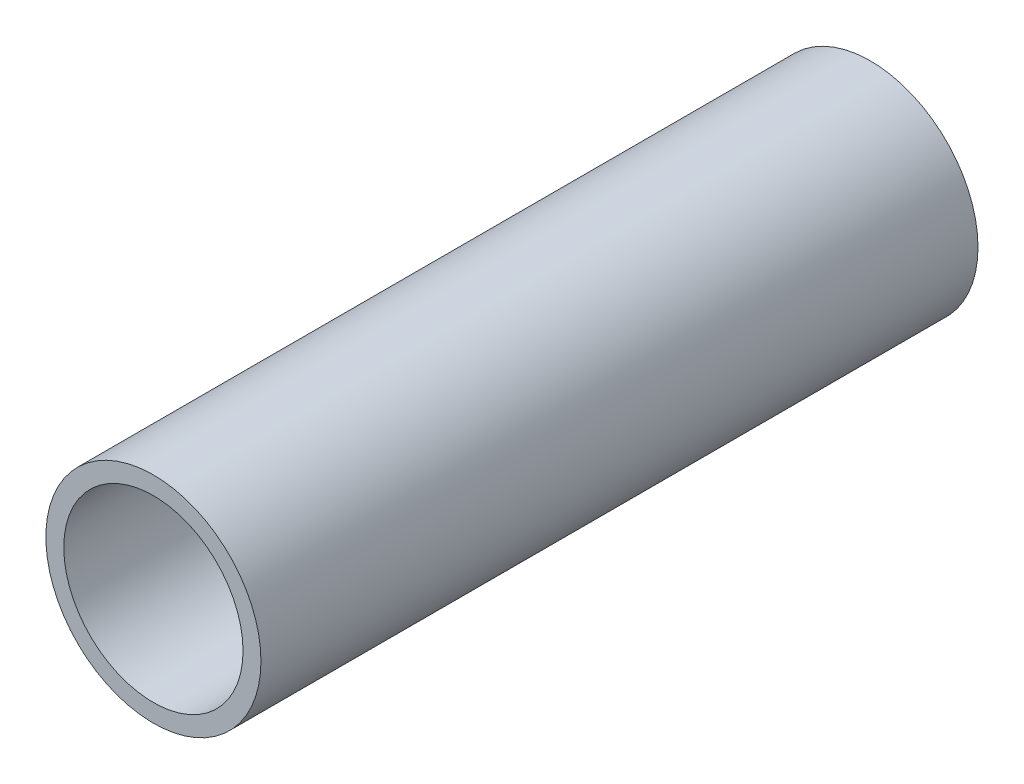
ISO-10303-21;
HEADER;
FILE_DESCRIPTION(('STEP AP214'),'2;1');
FILE_NAME('part.step','',(''),(''),'','','');
FILE_SCHEMA(('AUTOMOTIVE_DESIGN { 1 0 10303 214 1 1 1 1 }'));
ENDSEC;
DATA;
#1=APPLICATION_CONTEXT('core data for automotive mechanical design processes');
#2=APPLICATION_PROTOCOL_DEFINITION('international standard','automotive_design',2000,#1);
#3=PRODUCT_CONTEXT('',#1,'mechanical');
#4=PRODUCT('Part','Part','',(#3));
#5=PRODUCT_RELATED_PRODUCT_CATEGORY('part','',(#4));
#6=PRODUCT_DEFINITION_FORMATION('','',#4);
#7=PRODUCT_DEFINITION_CONTEXT('part definition',#1,'design');
#8=PRODUCT_DEFINITION('design','',#6,#7);
#9=PRODUCT_DEFINITION_SHAPE('','',#8);
#10=(LENGTH_UNIT() NAMED_UNIT(*) SI_UNIT(.MILLI.,.METRE.));
#11=(NAMED_UNIT(*) PLANE_ANGLE_UNIT() SI_UNIT($,.RADIAN.));
#12=(NAMED_UNIT(*) SI_UNIT($,.STERADIAN.) SOLID_ANGLE_UNIT());
#13=UNCERTAINTY_MEASURE_WITH_UNIT(LENGTH_MEASURE(1.E-05),#10,'distance_accuracy_value','');
#14=(GEOMETRIC_REPRESENTATION_CONTEXT(3) GLOBAL_UNCERTAINTY_ASSIGNED_CONTEXT((#13)) GLOBAL_UNIT_ASSIGNED_CONTEXT((#10,
#11,#12)) REPRESENTATION_CONTEXT('',''));
#15=CARTESIAN_POINT('',(0.,0.,0.));
#16=DIRECTION('',(0.,0.,1.));
#17=DIRECTION('',(1.,0.,0.));
#18=AXIS2_PLACEMENT_3D('',#15,#16,#17);
#19=CARTESIAN_POINT('',(0.,0.,200.));
#20=DIRECTION('',(0.,0.,1.));
#21=DIRECTION('',(1.,0.,0.));
#22=AXIS2_PLACEMENT_3D('',#19,#20,#21);
#23=PLANE('',#22);
#24=CARTESIAN_POINT('',(0.,0.,200.));
#25=DIRECTION('',(0.,0.,1.));
#26=DIRECTION('',(1.,0.,0.));
#27=AXIS2_PLACEMENT_3D('',#24,#25,#26);
#28=CIRCLE('',#27,30.);
#29=CARTESIAN_POINT('',(30.,0.,200.));
#30=VERTEX_POINT('',#29);
#31=EDGE_CURVE('E10',#30,#30,#28,.T.);
#32=ORIENTED_EDGE('',*,*,#31,.T.);
#33=EDGE_LOOP('',(#32));
#34=FACE_BOUND('',#33,.T.);
#35=CARTESIAN_POINT('',(0.,0.,200.));
#36=DIRECTION('',(0.,0.,1.));
#37=DIRECTION('',(1.,0.,0.));
#38=AXIS2_PLACEMENT_3D('',#35,#36,#37);
#39=CIRCLE('',#38,25.);
#40=CARTESIAN_POINT('',(25.,0.,200.));
#41=VERTEX_POINT('',#40);
#42=EDGE_CURVE('E50',#41,#41,#39,.T.);
#43=ORIENTED_EDGE('',*,*,#42,.F.);
#44=EDGE_LOOP('',(#43));
#45=FACE_BOUND('',#44,.T.);
#46=ADVANCED_FACE('F37',(#34,#45),#23,.T.);
#47=CARTESIAN_POINT('',(0.,0.,0.));
#48=DIRECTION('',(0.,0.,1.));
#49=DIRECTION('',(1.,0.,0.));
#50=AXIS2_PLACEMENT_3D('',#47,#48,#49);
#51=PLANE('',#50);
#52=CARTESIAN_POINT('',(0.,0.,0.));
#53=DIRECTION('',(0.,0.,1.));
#54=DIRECTION('',(1.,0.,0.));
#55=AXIS2_PLACEMENT_3D('',#52,#53,#54);
#56=CIRCLE('',#55,30.);
#57=CARTESIAN_POINT('',(30.,0.,0.));
#58=VERTEX_POINT('',#57);
#59=EDGE_CURVE('E41',#58,#58,#56,.T.);
#60=ORIENTED_EDGE('',*,*,#59,.F.);
#61=EDGE_LOOP('',(#60));
#62=FACE_BOUND('',#61,.T.);
#63=CARTESIAN_POINT('',(0.,0.,0.));
#64=DIRECTION('',(0.,0.,1.));
#65=DIRECTION('',(1.,0.,0.));
#66=AXIS2_PLACEMENT_3D('',#63,#64,#65);
#67=CIRCLE('',#66,25.);
#68=CARTESIAN_POINT('',(25.,0.,0.));
#69=VERTEX_POINT('',#68);
#70=EDGE_CURVE('E52',#69,#69,#67,.T.);
#71=ORIENTED_EDGE('',*,*,#70,.T.);
#72=EDGE_LOOP('',(#71));
#73=FACE_BOUND('',#72,.T.);
#74=ADVANCED_FACE('F64',(#62,#73),#51,.F.);
#75=CARTESIAN_POINT('',(0.,0.,200.));
#76=DIRECTION('',(0.,0.,-1.));
#77=DIRECTION('',(-1.,0.,0.));
#78=AXIS2_PLACEMENT_3D('',#75,#76,#77);
#79=CYLINDRICAL_SURFACE('',#78,30.);
#80=ORIENTED_EDGE('',*,*,#31,.F.);
#81=EDGE_LOOP('',(#80));
#82=FACE_BOUND('',#81,.T.);
#83=ORIENTED_EDGE('',*,*,#59,.T.);
#84=EDGE_LOOP('',(#83));
#85=FACE_BOUND('',#84,.T.);
#86=ADVANCED_FACE('F39',(#82,#85),#79,.T.);
#87=CARTESIAN_POINT('',(0.,0.,200.));
#88=DIRECTION('',(0.,0.,-1.));
#89=DIRECTION('',(-1.,0.,0.));
#90=AXIS2_PLACEMENT_3D('',#87,#88,#89);
#91=CYLINDRICAL_SURFACE('',#90,25.);
#92=ORIENTED_EDGE('',*,*,#42,.T.);
#93=EDGE_LOOP('',(#92));
#94=FACE_BOUND('',#93,.T.);
#95=ORIENTED_EDGE('',*,*,#70,.F.);
#96=EDGE_LOOP('',(#95));
#97=FACE_BOUND('',#96,.T.);
#98=ADVANCED_FACE('F60',(#94,#97),#91,.F.);
#99=CLOSED_SHELL('',(#46,#74,#86,#98));
#100=MANIFOLD_SOLID_BREP('B2',#99);
#101=ADVANCED_BREP_SHAPE_REPRESENTATION('',(#18,#100),#14);
#102=SHAPE_DEFINITION_REPRESENTATION(#9,#101);
ENDSEC;
END-ISO-10303-21;
